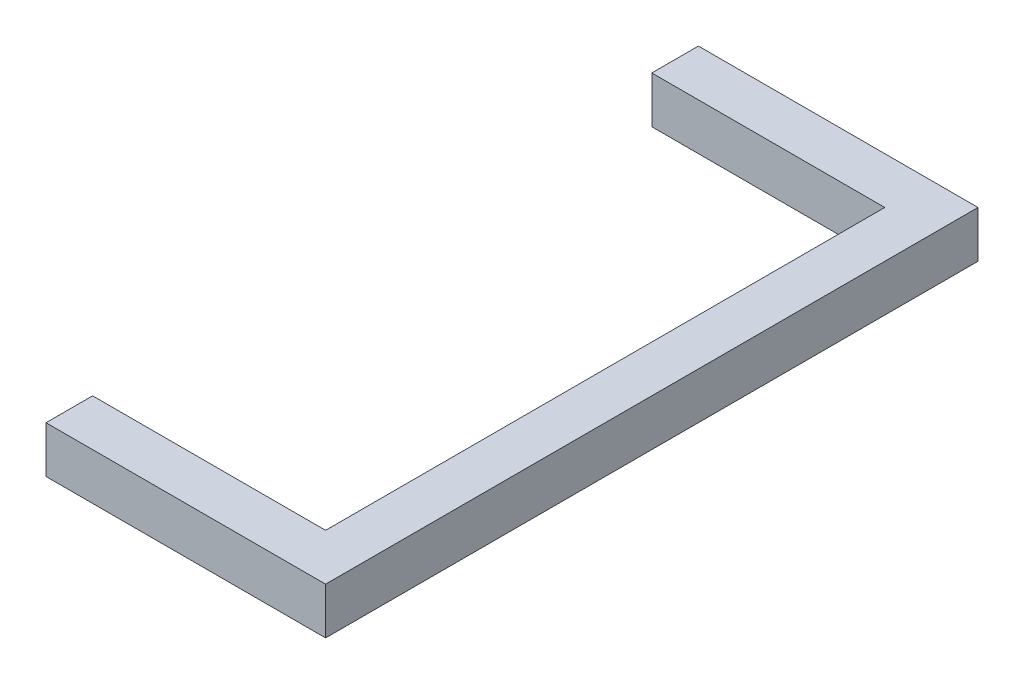
ISO-10303-21;
HEADER;
FILE_DESCRIPTION(('STEP AP214'),'2;1');
FILE_NAME('part.step','',(''),(''),'','','');
FILE_SCHEMA(('AUTOMOTIVE_DESIGN { 1 0 10303 214 1 1 1 1 }'));
ENDSEC;
DATA;
#1=APPLICATION_CONTEXT('core data for automotive mechanical design processes');
#2=APPLICATION_PROTOCOL_DEFINITION('international standard','automotive_design',2000,#1);
#3=PRODUCT_CONTEXT('',#1,'mechanical');
#4=PRODUCT('Part','Part','',(#3));
#5=PRODUCT_RELATED_PRODUCT_CATEGORY('part','',(#4));
#6=PRODUCT_DEFINITION_FORMATION('','',#4);
#7=PRODUCT_DEFINITION_CONTEXT('part definition',#1,'design');
#8=PRODUCT_DEFINITION('design','',#6,#7);
#9=PRODUCT_DEFINITION_SHAPE('','',#8);
#10=(LENGTH_UNIT() NAMED_UNIT(*) SI_UNIT(.MILLI.,.METRE.));
#11=(NAMED_UNIT(*) PLANE_ANGLE_UNIT() SI_UNIT($,.RADIAN.));
#12=(NAMED_UNIT(*) SI_UNIT($,.STERADIAN.) SOLID_ANGLE_UNIT());
#13=UNCERTAINTY_MEASURE_WITH_UNIT(LENGTH_MEASURE(1.E-05),#10,'distance_accuracy_value','');
#14=(GEOMETRIC_REPRESENTATION_CONTEXT(3) GLOBAL_UNCERTAINTY_ASSIGNED_CONTEXT((#13)) GLOBAL_UNIT_ASSIGNED_CONTEXT((#10,
#11,#12)) REPRESENTATION_CONTEXT('',''));
#15=CARTESIAN_POINT('',(0.,0.,0.));
#16=DIRECTION('',(0.,0.,1.));
#17=DIRECTION('',(1.,0.,0.));
#18=AXIS2_PLACEMENT_3D('',#15,#16,#17);
#19=CARTESIAN_POINT('',(3.175,1.5875,-22.225));
#20=DIRECTION('',(0.,0.,1.));
#21=DIRECTION('',(1.,0.,0.));
#22=AXIS2_PLACEMENT_3D('',#19,#20,#21);
#23=PLANE('',#22);
#24=DIRECTION('',(-1.,0.,0.));
#25=VECTOR('',#24,1.);
#26=CARTESIAN_POINT('',(3.175,-1.5875,-22.225));
#27=LINE('',#26,#25);
#28=CARTESIAN_POINT('',(3.175,-1.5875,-22.225));
#29=VERTEX_POINT('',#28);
#30=CARTESIAN_POINT('',(-15.875,-1.5875,-22.225));
#31=VERTEX_POINT('',#30);
#32=EDGE_CURVE('E129',#29,#31,#27,.T.);
#33=ORIENTED_EDGE('',*,*,#32,.T.);
#34=DIRECTION('',(0.,-1.,0.));
#35=VECTOR('',#34,1.);
#36=CARTESIAN_POINT('',(-15.875,1.5875,-22.225));
#37=LINE('',#36,#35);
#38=CARTESIAN_POINT('',(-15.875,1.5875,-22.225));
#39=VERTEX_POINT('',#38);
#40=EDGE_CURVE('E11',#39,#31,#37,.T.);
#41=ORIENTED_EDGE('',*,*,#40,.F.);
#42=DIRECTION('',(-1.,0.,0.));
#43=VECTOR('',#42,1.);
#44=CARTESIAN_POINT('',(3.175,1.5875,-22.225));
#45=LINE('',#44,#43);
#46=CARTESIAN_POINT('',(3.175,1.5875,-22.225));
#47=VERTEX_POINT('',#46);
#48=EDGE_CURVE('E143',#47,#39,#45,.T.);
#49=ORIENTED_EDGE('',*,*,#48,.F.);
#50=DIRECTION('',(0.,-1.,0.));
#51=VECTOR('',#50,1.);
#52=CARTESIAN_POINT('',(3.175,1.5875,-22.225));
#53=LINE('',#52,#51);
#54=EDGE_CURVE('E125',#47,#29,#53,.T.);
#55=ORIENTED_EDGE('',*,*,#54,.T.);
#56=EDGE_LOOP('',(#33,#41,#49,#55));
#57=FACE_BOUND('',#56,.T.);
#58=ADVANCED_FACE('F33',(#57),#23,.F.);
#59=CARTESIAN_POINT('',(-15.875,1.5875,-22.225));
#60=DIRECTION('',(1.,0.,0.));
#61=DIRECTION('',(0.,0.,-1.));
#62=AXIS2_PLACEMENT_3D('',#59,#60,#61);
#63=PLANE('',#62);
#64=DIRECTION('',(0.,0.,1.));
#65=VECTOR('',#64,1.);
#66=CARTESIAN_POINT('',(-15.875,-1.5875,-22.225));
#67=LINE('',#66,#65);
#68=CARTESIAN_POINT('',(-15.875,-1.5875,-19.05));
#69=VERTEX_POINT('',#68);
#70=EDGE_CURVE('E132',#31,#69,#67,.T.);
#71=ORIENTED_EDGE('',*,*,#70,.T.);
#72=DIRECTION('',(0.,-1.,0.));
#73=VECTOR('',#72,1.);
#74=CARTESIAN_POINT('',(-15.875,1.5875,-19.05));
#75=LINE('',#74,#73);
#76=CARTESIAN_POINT('',(-15.875,1.5875,-19.05));
#77=VERTEX_POINT('',#76);
#78=EDGE_CURVE('E41',#77,#69,#75,.T.);
#79=ORIENTED_EDGE('',*,*,#78,.F.);
#80=DIRECTION('',(0.,0.,1.));
#81=VECTOR('',#80,1.);
#82=CARTESIAN_POINT('',(-15.875,1.5875,-22.225));
#83=LINE('',#82,#81);
#84=EDGE_CURVE('E92',#39,#77,#83,.T.);
#85=ORIENTED_EDGE('',*,*,#84,.F.);
#86=ORIENTED_EDGE('',*,*,#40,.T.);
#87=EDGE_LOOP('',(#71,#79,#85,#86));
#88=FACE_BOUND('',#87,.T.);
#89=ADVANCED_FACE('F178',(#88),#63,.F.);
#90=CARTESIAN_POINT('',(-15.875,1.5875,-19.05));
#91=DIRECTION('',(0.,0.,-1.));
#92=DIRECTION('',(-1.,0.,0.));
#93=AXIS2_PLACEMENT_3D('',#90,#91,#92);
#94=PLANE('',#93);
#95=DIRECTION('',(1.,0.,0.));
#96=VECTOR('',#95,1.);
#97=CARTESIAN_POINT('',(-15.875,-1.5875,-19.05));
#98=LINE('',#97,#96);
#99=CARTESIAN_POINT('',(0.,-1.5875,-19.05));
#100=VERTEX_POINT('',#99);
#101=EDGE_CURVE('E134',#69,#100,#98,.T.);
#102=ORIENTED_EDGE('',*,*,#101,.T.);
#103=DIRECTION('',(0.,-1.,0.));
#104=VECTOR('',#103,1.);
#105=CARTESIAN_POINT('',(0.,1.5875,-19.05));
#106=LINE('',#105,#104);
#107=CARTESIAN_POINT('',(0.,1.5875,-19.05));
#108=VERTEX_POINT('',#107);
#109=EDGE_CURVE('E150',#108,#100,#106,.T.);
#110=ORIENTED_EDGE('',*,*,#109,.F.);
#111=DIRECTION('',(1.,0.,0.));
#112=VECTOR('',#111,1.);
#113=CARTESIAN_POINT('',(-15.875,1.5875,-19.05));
#114=LINE('',#113,#112);
#115=EDGE_CURVE('E158',#77,#108,#114,.T.);
#116=ORIENTED_EDGE('',*,*,#115,.F.);
#117=ORIENTED_EDGE('',*,*,#78,.T.);
#118=EDGE_LOOP('',(#102,#110,#116,#117));
#119=FACE_BOUND('',#118,.T.);
#120=ADVANCED_FACE('F156',(#119),#94,.F.);
#121=CARTESIAN_POINT('',(0.,1.5875,-19.05));
#122=DIRECTION('',(1.,0.,0.));
#123=DIRECTION('',(0.,0.,-1.));
#124=AXIS2_PLACEMENT_3D('',#121,#122,#123);
#125=PLANE('',#124);
#126=DIRECTION('',(0.,0.,1.));
#127=VECTOR('',#126,1.);
#128=CARTESIAN_POINT('',(0.,-1.5875,-19.05));
#129=LINE('',#128,#127);
#130=CARTESIAN_POINT('',(0.,-1.5875,19.05));
#131=VERTEX_POINT('',#130);
#132=EDGE_CURVE('E136',#100,#131,#129,.T.);
#133=ORIENTED_EDGE('',*,*,#132,.T.);
#134=DIRECTION('',(0.,-1.,0.));
#135=VECTOR('',#134,1.);
#136=CARTESIAN_POINT('',(0.,1.5875,19.05));
#137=LINE('',#136,#135);
#138=CARTESIAN_POINT('',(0.,1.5875,19.05));
#139=VERTEX_POINT('',#138);
#140=EDGE_CURVE('E147',#139,#131,#137,.T.);
#141=ORIENTED_EDGE('',*,*,#140,.F.);
#142=DIRECTION('',(0.,0.,1.));
#143=VECTOR('',#142,1.);
#144=CARTESIAN_POINT('',(0.,1.5875,-19.05));
#145=LINE('',#144,#143);
#146=EDGE_CURVE('E170',#108,#139,#145,.T.);
#147=ORIENTED_EDGE('',*,*,#146,.F.);
#148=ORIENTED_EDGE('',*,*,#109,.T.);
#149=EDGE_LOOP('',(#133,#141,#147,#148));
#150=FACE_BOUND('',#149,.T.);
#151=ADVANCED_FACE('F166',(#150),#125,.F.);
#152=CARTESIAN_POINT('',(-15.875,1.5875,19.05));
#153=DIRECTION('',(0.,0.,1.));
#154=DIRECTION('',(1.,0.,0.));
#155=AXIS2_PLACEMENT_3D('',#152,#153,#154);
#156=PLANE('',#155);
#157=DIRECTION('',(-1.,0.,0.));
#158=VECTOR('',#157,1.);
#159=CARTESIAN_POINT('',(-15.875,-1.5875,19.05));
#160=LINE('',#159,#158);
#161=CARTESIAN_POINT('',(-15.875,-1.5875,19.05));
#162=VERTEX_POINT('',#161);
#163=EDGE_CURVE('E138',#131,#162,#160,.T.);
#164=ORIENTED_EDGE('',*,*,#163,.T.);
#165=DIRECTION('',(0.,-1.,0.));
#166=VECTOR('',#165,1.);
#167=CARTESIAN_POINT('',(-15.875,1.5875,19.05));
#168=LINE('',#167,#166);
#169=CARTESIAN_POINT('',(-15.875,1.5875,19.05));
#170=VERTEX_POINT('',#169);
#171=EDGE_CURVE('E120',#170,#162,#168,.T.);
#172=ORIENTED_EDGE('',*,*,#171,.F.);
#173=DIRECTION('',(-1.,0.,0.));
#174=VECTOR('',#173,1.);
#175=CARTESIAN_POINT('',(-15.875,1.5875,19.05));
#176=LINE('',#175,#174);
#177=EDGE_CURVE('E111',#139,#170,#176,.T.);
#178=ORIENTED_EDGE('',*,*,#177,.F.);
#179=ORIENTED_EDGE('',*,*,#140,.T.);
#180=EDGE_LOOP('',(#164,#172,#178,#179));
#181=FACE_BOUND('',#180,.T.);
#182=ADVANCED_FACE('F169',(#181),#156,.F.);
#183=CARTESIAN_POINT('',(-15.875,1.5875,22.225));
#184=DIRECTION('',(1.,0.,0.));
#185=DIRECTION('',(0.,0.,-1.));
#186=AXIS2_PLACEMENT_3D('',#183,#184,#185);
#187=PLANE('',#186);
#188=DIRECTION('',(0.,0.,1.));
#189=VECTOR('',#188,1.);
#190=CARTESIAN_POINT('',(-15.875,-1.5875,22.225));
#191=LINE('',#190,#189);
#192=CARTESIAN_POINT('',(-15.875,-1.5875,22.225));
#193=VERTEX_POINT('',#192);
#194=EDGE_CURVE('E119',#162,#193,#191,.T.);
#195=ORIENTED_EDGE('',*,*,#194,.T.);
#196=DIRECTION('',(0.,-1.,0.));
#197=VECTOR('',#196,1.);
#198=CARTESIAN_POINT('',(-15.875,1.5875,22.225));
#199=LINE('',#198,#197);
#200=CARTESIAN_POINT('',(-15.875,1.5875,22.225));
#201=VERTEX_POINT('',#200);
#202=EDGE_CURVE('E116',#201,#193,#199,.T.);
#203=ORIENTED_EDGE('',*,*,#202,.F.);
#204=DIRECTION('',(0.,0.,1.));
#205=VECTOR('',#204,1.);
#206=CARTESIAN_POINT('',(-15.875,1.5875,22.225));
#207=LINE('',#206,#205);
#208=EDGE_CURVE('E105',#170,#201,#207,.T.);
#209=ORIENTED_EDGE('',*,*,#208,.F.);
#210=ORIENTED_EDGE('',*,*,#171,.T.);
#211=EDGE_LOOP('',(#195,#203,#209,#210));
#212=FACE_BOUND('',#211,.T.);
#213=ADVANCED_FACE('F117',(#212),#187,.F.);
#214=CARTESIAN_POINT('',(3.175,1.5875,22.225));
#215=DIRECTION('',(0.,0.,-1.));
#216=DIRECTION('',(-1.,0.,0.));
#217=AXIS2_PLACEMENT_3D('',#214,#215,#216);
#218=PLANE('',#217);
#219=DIRECTION('',(1.,0.,0.));
#220=VECTOR('',#219,1.);
#221=CARTESIAN_POINT('',(3.175,-1.5875,22.225));
#222=LINE('',#221,#220);
#223=CARTESIAN_POINT('',(3.175,-1.5875,22.225));
#224=VERTEX_POINT('',#223);
#225=EDGE_CURVE('E78',#193,#224,#222,.T.);
#226=ORIENTED_EDGE('',*,*,#225,.T.);
#227=DIRECTION('',(0.,-1.,0.));
#228=VECTOR('',#227,1.);
#229=CARTESIAN_POINT('',(3.175,1.5875,22.225));
#230=LINE('',#229,#228);
#231=CARTESIAN_POINT('',(3.175,1.5875,22.225));
#232=VERTEX_POINT('',#231);
#233=EDGE_CURVE('E121',#232,#224,#230,.T.);
#234=ORIENTED_EDGE('',*,*,#233,.F.);
#235=DIRECTION('',(1.,0.,0.));
#236=VECTOR('',#235,1.);
#237=CARTESIAN_POINT('',(3.175,1.5875,22.225));
#238=LINE('',#237,#236);
#239=EDGE_CURVE('E109',#201,#232,#238,.T.);
#240=ORIENTED_EDGE('',*,*,#239,.F.);
#241=ORIENTED_EDGE('',*,*,#202,.T.);
#242=EDGE_LOOP('',(#226,#234,#240,#241));
#243=FACE_BOUND('',#242,.T.);
#244=ADVANCED_FACE('F123',(#243),#218,.F.);
#245=CARTESIAN_POINT('',(3.175,1.5875,22.225));
#246=DIRECTION('',(-1.,0.,0.));
#247=DIRECTION('',(0.,0.,1.));
#248=AXIS2_PLACEMENT_3D('',#245,#246,#247);
#249=PLANE('',#248);
#250=DIRECTION('',(0.,0.,-1.));
#251=VECTOR('',#250,1.);
#252=CARTESIAN_POINT('',(3.175,-1.5875,22.225));
#253=LINE('',#252,#251);
#254=EDGE_CURVE('E84',#224,#29,#253,.T.);
#255=ORIENTED_EDGE('',*,*,#254,.T.);
#256=ORIENTED_EDGE('',*,*,#54,.F.);
#257=DIRECTION('',(0.,0.,-1.));
#258=VECTOR('',#257,1.);
#259=CARTESIAN_POINT('',(3.175,1.5875,22.225));
#260=LINE('',#259,#258);
#261=EDGE_CURVE('E49',#232,#47,#260,.T.);
#262=ORIENTED_EDGE('',*,*,#261,.F.);
#263=ORIENTED_EDGE('',*,*,#233,.T.);
#264=EDGE_LOOP('',(#255,#256,#262,#263));
#265=FACE_BOUND('',#264,.T.);
#266=ADVANCED_FACE('F194',(#265),#249,.F.);
#267=CARTESIAN_POINT('',(0.,1.5875,0.));
#268=DIRECTION('',(0.,1.,0.));
#269=DIRECTION('',(0.,0.,1.));
#270=AXIS2_PLACEMENT_3D('',#267,#268,#269);
#271=PLANE('',#270);
#272=ORIENTED_EDGE('',*,*,#48,.T.);
#273=ORIENTED_EDGE('',*,*,#84,.T.);
#274=ORIENTED_EDGE('',*,*,#115,.T.);
#275=ORIENTED_EDGE('',*,*,#146,.T.);
#276=ORIENTED_EDGE('',*,*,#177,.T.);
#277=ORIENTED_EDGE('',*,*,#208,.T.);
#278=ORIENTED_EDGE('',*,*,#239,.T.);
#279=ORIENTED_EDGE('',*,*,#261,.T.);
#280=EDGE_LOOP('',(#272,#273,#274,#275,#276,#277,#278,#279));
#281=FACE_BOUND('',#280,.T.);
#282=ADVANCED_FACE('F107',(#281),#271,.T.);
#283=CARTESIAN_POINT('',(0.,-1.5875,0.));
#284=DIRECTION('',(0.,1.,0.));
#285=DIRECTION('',(0.,0.,1.));
#286=AXIS2_PLACEMENT_3D('',#283,#284,#285);
#287=PLANE('',#286);
#288=ORIENTED_EDGE('',*,*,#32,.F.);
#289=ORIENTED_EDGE('',*,*,#254,.F.);
#290=ORIENTED_EDGE('',*,*,#225,.F.);
#291=ORIENTED_EDGE('',*,*,#194,.F.);
#292=ORIENTED_EDGE('',*,*,#163,.F.);
#293=ORIENTED_EDGE('',*,*,#132,.F.);
#294=ORIENTED_EDGE('',*,*,#101,.F.);
#295=ORIENTED_EDGE('',*,*,#70,.F.);
#296=EDGE_LOOP('',(#288,#289,#290,#291,#292,#293,#294,#295));
#297=FACE_BOUND('',#296,.T.);
#298=ADVANCED_FACE('F162',(#297),#287,.F.);
#299=CLOSED_SHELL('',(#58,#89,#120,#151,#182,#213,#244,#266,#282,#298));
#300=MANIFOLD_SOLID_BREP('B2',#299);
#301=ADVANCED_BREP_SHAPE_REPRESENTATION('',(#18,#300),#14);
#302=SHAPE_DEFINITION_REPRESENTATION(#9,#301);
ENDSEC;
END-ISO-10303-21;
